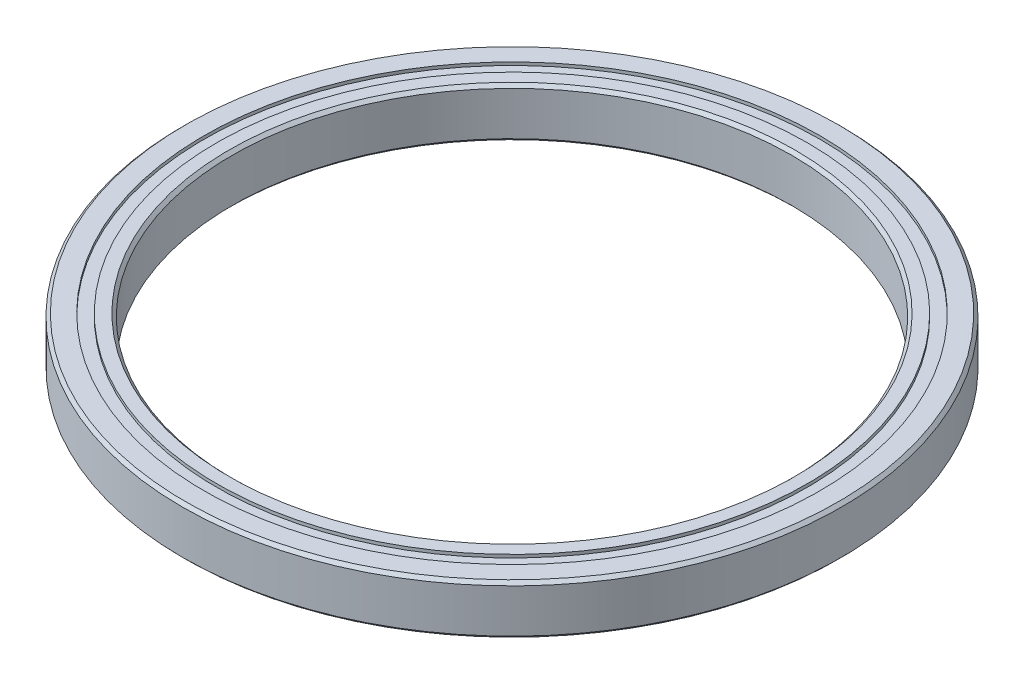
ISO-10303-21;
HEADER;
FILE_DESCRIPTION(('STEP AP214'),'2;1');
FILE_NAME('part.step','',(''),(''),'','','');
FILE_SCHEMA(('AUTOMOTIVE_DESIGN { 1 0 10303 214 1 1 1 1 }'));
ENDSEC;
DATA;
#1=APPLICATION_CONTEXT('core data for automotive mechanical design processes');
#2=APPLICATION_PROTOCOL_DEFINITION('international standard','automotive_design',2000,#1);
#3=PRODUCT_CONTEXT('',#1,'mechanical');
#4=PRODUCT('Part','Part','',(#3));
#5=PRODUCT_RELATED_PRODUCT_CATEGORY('part','',(#4));
#6=PRODUCT_DEFINITION_FORMATION('','',#4);
#7=PRODUCT_DEFINITION_CONTEXT('part definition',#1,'design');
#8=PRODUCT_DEFINITION('design','',#6,#7);
#9=PRODUCT_DEFINITION_SHAPE('','',#8);
#10=(LENGTH_UNIT() NAMED_UNIT(*) SI_UNIT(.MILLI.,.METRE.));
#11=(NAMED_UNIT(*) PLANE_ANGLE_UNIT() SI_UNIT($,.RADIAN.));
#12=(NAMED_UNIT(*) SI_UNIT($,.STERADIAN.) SOLID_ANGLE_UNIT());
#13=UNCERTAINTY_MEASURE_WITH_UNIT(LENGTH_MEASURE(1.E-05),#10,'distance_accuracy_value','');
#14=(GEOMETRIC_REPRESENTATION_CONTEXT(3) GLOBAL_UNCERTAINTY_ASSIGNED_CONTEXT((#13)) GLOBAL_UNIT_ASSIGNED_CONTEXT((#10,
#11,#12)) REPRESENTATION_CONTEXT('',''));
#15=CARTESIAN_POINT('',(0.,0.,0.));
#16=DIRECTION('',(0.,0.,1.));
#17=DIRECTION('',(1.,0.,0.));
#18=AXIS2_PLACEMENT_3D('',#15,#16,#17);
#19=CARTESIAN_POINT('',(0.,0.,0.));
#20=DIRECTION('',(0.,-1.,0.));
#21=DIRECTION('',(0.,0.,-1.));
#22=AXIS2_PLACEMENT_3D('',#19,#20,#21);
#23=CYLINDRICAL_SURFACE('',#22,49.5);
#24=CARTESIAN_POINT('',(0.,7.99999999999999,0.));
#25=DIRECTION('',(0.,-1.,0.));
#26=DIRECTION('',(0.,0.,-1.));
#27=AXIS2_PLACEMENT_3D('',#24,#25,#26);
#28=CIRCLE('',#27,49.5);
#29=CARTESIAN_POINT('',(0.,7.99999999999999,-49.5));
#30=VERTEX_POINT('',#29);
#31=EDGE_CURVE('E10',#30,#30,#28,.T.);
#32=ORIENTED_EDGE('',*,*,#31,.F.);
#33=EDGE_LOOP('',(#32));
#34=FACE_BOUND('',#33,.T.);
#35=CARTESIAN_POINT('',(0.,7.5,0.));
#36=DIRECTION('',(0.,-1.,0.));
#37=DIRECTION('',(0.,0.,-1.));
#38=AXIS2_PLACEMENT_3D('',#35,#36,#37);
#39=CIRCLE('',#38,49.5);
#40=CARTESIAN_POINT('',(0.,7.5,-49.5));
#41=VERTEX_POINT('',#40);
#42=EDGE_CURVE('E86',#41,#41,#39,.T.);
#43=ORIENTED_EDGE('',*,*,#42,.T.);
#44=EDGE_LOOP('',(#43));
#45=FACE_BOUND('',#44,.T.);
#46=ADVANCED_FACE('F34',(#34,#45),#23,.F.);
#47=CARTESIAN_POINT('',(-52.5,8.,0.));
#48=DIRECTION('',(0.,-1.,0.));
#49=DIRECTION('',(0.,0.,-1.));
#50=AXIS2_PLACEMENT_3D('',#47,#48,#49);
#51=PLANE('',#50);
#52=CARTESIAN_POINT('',(0.,8.,0.));
#53=DIRECTION('',(0.,-1.,0.));
#54=DIRECTION('',(0.,0.,-1.));
#55=AXIS2_PLACEMENT_3D('',#52,#53,#54);
#56=CIRCLE('',#55,52.5);
#57=CARTESIAN_POINT('',(0.,8.,-52.5));
#58=VERTEX_POINT('',#57);
#59=EDGE_CURVE('E40',#58,#58,#56,.T.);
#60=ORIENTED_EDGE('',*,*,#59,.F.);
#61=EDGE_LOOP('',(#60));
#62=FACE_BOUND('',#61,.T.);
#63=ORIENTED_EDGE('',*,*,#31,.T.);
#64=EDGE_LOOP('',(#63));
#65=FACE_BOUND('',#64,.T.);
#66=ADVANCED_FACE('F171',(#62,#65),#51,.F.);
#67=CARTESIAN_POINT('',(0.,8.,0.));
#68=DIRECTION('',(0.,-1.,0.));
#69=DIRECTION('',(0.,0.,-1.));
#70=AXIS2_PLACEMENT_3D('',#67,#68,#69);
#71=CONICAL_SURFACE('',#70,52.5,0.785398163397448);
#72=CARTESIAN_POINT('',(0.,7.5,0.));
#73=DIRECTION('',(0.,-1.,0.));
#74=DIRECTION('',(0.,0.,-1.));
#75=AXIS2_PLACEMENT_3D('',#72,#73,#74);
#76=CIRCLE('',#75,53.);
#77=CARTESIAN_POINT('',(0.,7.5,-53.));
#78=VERTEX_POINT('',#77);
#79=EDGE_CURVE('E44',#78,#78,#76,.T.);
#80=ORIENTED_EDGE('',*,*,#79,.F.);
#81=EDGE_LOOP('',(#80));
#82=FACE_BOUND('',#81,.T.);
#83=ORIENTED_EDGE('',*,*,#59,.T.);
#84=EDGE_LOOP('',(#83));
#85=FACE_BOUND('',#84,.T.);
#86=ADVANCED_FACE('F166',(#82,#85),#71,.T.);
#87=CARTESIAN_POINT('',(0.,0.,0.));
#88=DIRECTION('',(0.,-1.,0.));
#89=DIRECTION('',(0.,0.,-1.));
#90=AXIS2_PLACEMENT_3D('',#87,#88,#89);
#91=CYLINDRICAL_SURFACE('',#90,53.);
#92=CARTESIAN_POINT('',(0.,0.499999999999999,0.));
#93=DIRECTION('',(0.,-1.,0.));
#94=DIRECTION('',(0.,0.,-1.));
#95=AXIS2_PLACEMENT_3D('',#92,#93,#94);
#96=CIRCLE('',#95,53.);
#97=CARTESIAN_POINT('',(0.,0.499999999999999,-53.));
#98=VERTEX_POINT('',#97);
#99=EDGE_CURVE('E48',#98,#98,#96,.T.);
#100=ORIENTED_EDGE('',*,*,#99,.F.);
#101=EDGE_LOOP('',(#100));
#102=FACE_BOUND('',#101,.T.);
#103=ORIENTED_EDGE('',*,*,#79,.T.);
#104=EDGE_LOOP('',(#103));
#105=FACE_BOUND('',#104,.T.);
#106=ADVANCED_FACE('F160',(#102,#105),#91,.T.);
#107=CARTESIAN_POINT('',(0.,0.499999999999999,0.));
#108=DIRECTION('',(0.,1.,0.));
#109=DIRECTION('',(0.,0.,1.));
#110=AXIS2_PLACEMENT_3D('',#107,#108,#109);
#111=CONICAL_SURFACE('',#110,53.,0.785398163397448);
#112=CARTESIAN_POINT('',(0.,0.,0.));
#113=DIRECTION('',(0.,-1.,0.));
#114=DIRECTION('',(0.,0.,-1.));
#115=AXIS2_PLACEMENT_3D('',#112,#113,#114);
#116=CIRCLE('',#115,52.5);
#117=CARTESIAN_POINT('',(0.,0.,-52.5));
#118=VERTEX_POINT('',#117);
#119=EDGE_CURVE('E53',#118,#118,#116,.T.);
#120=ORIENTED_EDGE('',*,*,#119,.F.);
#121=EDGE_LOOP('',(#120));
#122=FACE_BOUND('',#121,.T.);
#123=ORIENTED_EDGE('',*,*,#99,.T.);
#124=EDGE_LOOP('',(#123));
#125=FACE_BOUND('',#124,.T.);
#126=ADVANCED_FACE('F154',(#122,#125),#111,.T.);
#127=CARTESIAN_POINT('',(-49.5,0.,0.));
#128=DIRECTION('',(0.,1.,0.));
#129=DIRECTION('',(0.,0.,1.));
#130=AXIS2_PLACEMENT_3D('',#127,#128,#129);
#131=PLANE('',#130);
#132=CARTESIAN_POINT('',(0.,0.,0.));
#133=DIRECTION('',(0.,-1.,0.));
#134=DIRECTION('',(0.,0.,-1.));
#135=AXIS2_PLACEMENT_3D('',#132,#133,#134);
#136=CIRCLE('',#135,49.5);
#137=CARTESIAN_POINT('',(0.,0.,-49.5));
#138=VERTEX_POINT('',#137);
#139=EDGE_CURVE('E56',#138,#138,#136,.T.);
#140=ORIENTED_EDGE('',*,*,#139,.F.);
#141=EDGE_LOOP('',(#140));
#142=FACE_BOUND('',#141,.T.);
#143=ORIENTED_EDGE('',*,*,#119,.T.);
#144=EDGE_LOOP('',(#143));
#145=FACE_BOUND('',#144,.T.);
#146=ADVANCED_FACE('F148',(#142,#145),#131,.F.);
#147=CARTESIAN_POINT('',(0.,0.,0.));
#148=DIRECTION('',(0.,-1.,0.));
#149=DIRECTION('',(0.,0.,-1.));
#150=AXIS2_PLACEMENT_3D('',#147,#148,#149);
#151=CYLINDRICAL_SURFACE('',#150,49.5);
#152=CARTESIAN_POINT('',(0.,0.499999999999994,0.));
#153=DIRECTION('',(0.,-1.,0.));
#154=DIRECTION('',(0.,0.,-1.));
#155=AXIS2_PLACEMENT_3D('',#152,#153,#154);
#156=CIRCLE('',#155,49.5);
#157=CARTESIAN_POINT('',(0.,0.499999999999994,-49.5));
#158=VERTEX_POINT('',#157);
#159=EDGE_CURVE('E59',#158,#158,#156,.T.);
#160=ORIENTED_EDGE('',*,*,#159,.F.);
#161=EDGE_LOOP('',(#160));
#162=FACE_BOUND('',#161,.T.);
#163=ORIENTED_EDGE('',*,*,#139,.T.);
#164=EDGE_LOOP('',(#163));
#165=FACE_BOUND('',#164,.T.);
#166=ADVANCED_FACE('F142',(#162,#165),#151,.F.);
#167=CARTESIAN_POINT('',(-49.5,0.499999999999993,0.));
#168=DIRECTION('',(0.,1.,0.));
#169=DIRECTION('',(0.,0.,1.));
#170=AXIS2_PLACEMENT_3D('',#167,#168,#169);
#171=PLANE('',#170);
#172=CARTESIAN_POINT('',(0.,0.499999999999993,0.));
#173=DIRECTION('',(0.,-1.,0.));
#174=DIRECTION('',(0.,0.,-1.));
#175=AXIS2_PLACEMENT_3D('',#172,#173,#174);
#176=CIRCLE('',#175,47.5);
#177=CARTESIAN_POINT('',(0.,0.499999999999993,-47.5));
#178=VERTEX_POINT('',#177);
#179=EDGE_CURVE('E62',#178,#178,#176,.T.);
#180=ORIENTED_EDGE('',*,*,#179,.F.);
#181=EDGE_LOOP('',(#180));
#182=FACE_BOUND('',#181,.T.);
#183=ORIENTED_EDGE('',*,*,#159,.T.);
#184=EDGE_LOOP('',(#183));
#185=FACE_BOUND('',#184,.T.);
#186=ADVANCED_FACE('F136',(#182,#185),#171,.F.);
#187=CARTESIAN_POINT('',(0.,0.,0.));
#188=DIRECTION('',(0.,-1.,0.));
#189=DIRECTION('',(0.,0.,-1.));
#190=AXIS2_PLACEMENT_3D('',#187,#188,#189);
#191=CYLINDRICAL_SURFACE('',#190,47.5);
#192=CARTESIAN_POINT('',(0.,0.,0.));
#193=DIRECTION('',(0.,-1.,0.));
#194=DIRECTION('',(0.,0.,-1.));
#195=AXIS2_PLACEMENT_3D('',#192,#193,#194);
#196=CIRCLE('',#195,47.5);
#197=CARTESIAN_POINT('',(0.,0.,-47.5));
#198=VERTEX_POINT('',#197);
#199=EDGE_CURVE('E65',#198,#198,#196,.T.);
#200=ORIENTED_EDGE('',*,*,#199,.F.);
#201=EDGE_LOOP('',(#200));
#202=FACE_BOUND('',#201,.T.);
#203=ORIENTED_EDGE('',*,*,#179,.T.);
#204=EDGE_LOOP('',(#203));
#205=FACE_BOUND('',#204,.T.);
#206=ADVANCED_FACE('F130',(#202,#205),#191,.T.);
#207=CARTESIAN_POINT('',(-45.5,0.,0.));
#208=DIRECTION('',(0.,1.,0.));
#209=DIRECTION('',(0.,0.,1.));
#210=AXIS2_PLACEMENT_3D('',#207,#208,#209);
#211=PLANE('',#210);
#212=CARTESIAN_POINT('',(0.,0.,0.));
#213=DIRECTION('',(0.,-1.,0.));
#214=DIRECTION('',(0.,0.,-1.));
#215=AXIS2_PLACEMENT_3D('',#212,#213,#214);
#216=CIRCLE('',#215,45.5);
#217=CARTESIAN_POINT('',(0.,0.,-45.5));
#218=VERTEX_POINT('',#217);
#219=EDGE_CURVE('E68',#218,#218,#216,.T.);
#220=ORIENTED_EDGE('',*,*,#219,.F.);
#221=EDGE_LOOP('',(#220));
#222=FACE_BOUND('',#221,.T.);
#223=ORIENTED_EDGE('',*,*,#199,.T.);
#224=EDGE_LOOP('',(#223));
#225=FACE_BOUND('',#224,.T.);
#226=ADVANCED_FACE('F124',(#222,#225),#211,.F.);
#227=CARTESIAN_POINT('',(0.,0.,0.));
#228=DIRECTION('',(0.,-1.,0.));
#229=DIRECTION('',(0.,0.,-1.));
#230=AXIS2_PLACEMENT_3D('',#227,#228,#229);
#231=CONICAL_SURFACE('',#230,45.5,0.785398163397447);
#232=CARTESIAN_POINT('',(0.,0.5,0.));
#233=DIRECTION('',(0.,-1.,0.));
#234=DIRECTION('',(0.,0.,-1.));
#235=AXIS2_PLACEMENT_3D('',#232,#233,#234);
#236=CIRCLE('',#235,45.);
#237=CARTESIAN_POINT('',(0.,0.5,-45.));
#238=VERTEX_POINT('',#237);
#239=EDGE_CURVE('E71',#238,#238,#236,.T.);
#240=ORIENTED_EDGE('',*,*,#239,.F.);
#241=EDGE_LOOP('',(#240));
#242=FACE_BOUND('',#241,.T.);
#243=ORIENTED_EDGE('',*,*,#219,.T.);
#244=EDGE_LOOP('',(#243));
#245=FACE_BOUND('',#244,.T.);
#246=ADVANCED_FACE('F118',(#242,#245),#231,.F.);
#247=CARTESIAN_POINT('',(0.,0.,0.));
#248=DIRECTION('',(0.,-1.,0.));
#249=DIRECTION('',(0.,0.,-1.));
#250=AXIS2_PLACEMENT_3D('',#247,#248,#249);
#251=CYLINDRICAL_SURFACE('',#250,45.);
#252=CARTESIAN_POINT('',(0.,7.5,0.));
#253=DIRECTION('',(0.,-1.,0.));
#254=DIRECTION('',(0.,0.,-1.));
#255=AXIS2_PLACEMENT_3D('',#252,#253,#254);
#256=CIRCLE('',#255,45.);
#257=CARTESIAN_POINT('',(0.,7.5,-45.));
#258=VERTEX_POINT('',#257);
#259=EDGE_CURVE('E74',#258,#258,#256,.T.);
#260=ORIENTED_EDGE('',*,*,#259,.F.);
#261=EDGE_LOOP('',(#260));
#262=FACE_BOUND('',#261,.T.);
#263=ORIENTED_EDGE('',*,*,#239,.T.);
#264=EDGE_LOOP('',(#263));
#265=FACE_BOUND('',#264,.T.);
#266=ADVANCED_FACE('F112',(#262,#265),#251,.F.);
#267=CARTESIAN_POINT('',(0.,7.5,0.));
#268=DIRECTION('',(0.,1.,0.));
#269=DIRECTION('',(0.,0.,1.));
#270=AXIS2_PLACEMENT_3D('',#267,#268,#269);
#271=CONICAL_SURFACE('',#270,45.,0.78539816339745);
#272=CARTESIAN_POINT('',(0.,8.,0.));
#273=DIRECTION('',(0.,-1.,0.));
#274=DIRECTION('',(0.,0.,-1.));
#275=AXIS2_PLACEMENT_3D('',#272,#273,#274);
#276=CIRCLE('',#275,45.5);
#277=CARTESIAN_POINT('',(0.,8.,-45.5));
#278=VERTEX_POINT('',#277);
#279=EDGE_CURVE('E77',#278,#278,#276,.T.);
#280=ORIENTED_EDGE('',*,*,#279,.F.);
#281=EDGE_LOOP('',(#280));
#282=FACE_BOUND('',#281,.T.);
#283=ORIENTED_EDGE('',*,*,#259,.T.);
#284=EDGE_LOOP('',(#283));
#285=FACE_BOUND('',#284,.T.);
#286=ADVANCED_FACE('F106',(#282,#285),#271,.F.);
#287=CARTESIAN_POINT('',(-47.5,8.,0.));
#288=DIRECTION('',(0.,-1.,0.));
#289=DIRECTION('',(0.,0.,-1.));
#290=AXIS2_PLACEMENT_3D('',#287,#288,#289);
#291=PLANE('',#290);
#292=CARTESIAN_POINT('',(0.,7.99999999999999,0.));
#293=DIRECTION('',(0.,-1.,0.));
#294=DIRECTION('',(0.,0.,-1.));
#295=AXIS2_PLACEMENT_3D('',#292,#293,#294);
#296=CIRCLE('',#295,47.5);
#297=CARTESIAN_POINT('',(0.,7.99999999999999,-47.5));
#298=VERTEX_POINT('',#297);
#299=EDGE_CURVE('E80',#298,#298,#296,.T.);
#300=ORIENTED_EDGE('',*,*,#299,.F.);
#301=EDGE_LOOP('',(#300));
#302=FACE_BOUND('',#301,.T.);
#303=ORIENTED_EDGE('',*,*,#279,.T.);
#304=EDGE_LOOP('',(#303));
#305=FACE_BOUND('',#304,.T.);
#306=ADVANCED_FACE('F100',(#302,#305),#291,.F.);
#307=CARTESIAN_POINT('',(0.,0.,0.));
#308=DIRECTION('',(0.,-1.,0.));
#309=DIRECTION('',(0.,0.,-1.));
#310=AXIS2_PLACEMENT_3D('',#307,#308,#309);
#311=CYLINDRICAL_SURFACE('',#310,47.5);
#312=CARTESIAN_POINT('',(0.,7.5,0.));
#313=DIRECTION('',(0.,-1.,0.));
#314=DIRECTION('',(0.,0.,-1.));
#315=AXIS2_PLACEMENT_3D('',#312,#313,#314);
#316=CIRCLE('',#315,47.5);
#317=CARTESIAN_POINT('',(0.,7.5,-47.5));
#318=VERTEX_POINT('',#317);
#319=EDGE_CURVE('E83',#318,#318,#316,.T.);
#320=ORIENTED_EDGE('',*,*,#319,.F.);
#321=EDGE_LOOP('',(#320));
#322=FACE_BOUND('',#321,.T.);
#323=ORIENTED_EDGE('',*,*,#299,.T.);
#324=EDGE_LOOP('',(#323));
#325=FACE_BOUND('',#324,.T.);
#326=ADVANCED_FACE('F94',(#322,#325),#311,.T.);
#327=CARTESIAN_POINT('',(-49.5,7.5,0.));
#328=DIRECTION('',(0.,-1.,0.));
#329=DIRECTION('',(0.,0.,-1.));
#330=AXIS2_PLACEMENT_3D('',#327,#328,#329);
#331=PLANE('',#330);
#332=ORIENTED_EDGE('',*,*,#42,.F.);
#333=EDGE_LOOP('',(#332));
#334=FACE_BOUND('',#333,.T.);
#335=ORIENTED_EDGE('',*,*,#319,.T.);
#336=EDGE_LOOP('',(#335));
#337=FACE_BOUND('',#336,.T.);
#338=ADVANCED_FACE('F91',(#334,#337),#331,.F.);
#339=CLOSED_SHELL('',(#46,#66,#86,#106,#126,#146,#166,#186,#206,#226,#246,#266,#286,#306,#326,#338));
#340=MANIFOLD_SOLID_BREP('B2',#339);
#341=ADVANCED_BREP_SHAPE_REPRESENTATION('',(#18,#340),#14);
#342=SHAPE_DEFINITION_REPRESENTATION(#9,#341);
ENDSEC;
END-ISO-10303-21;
